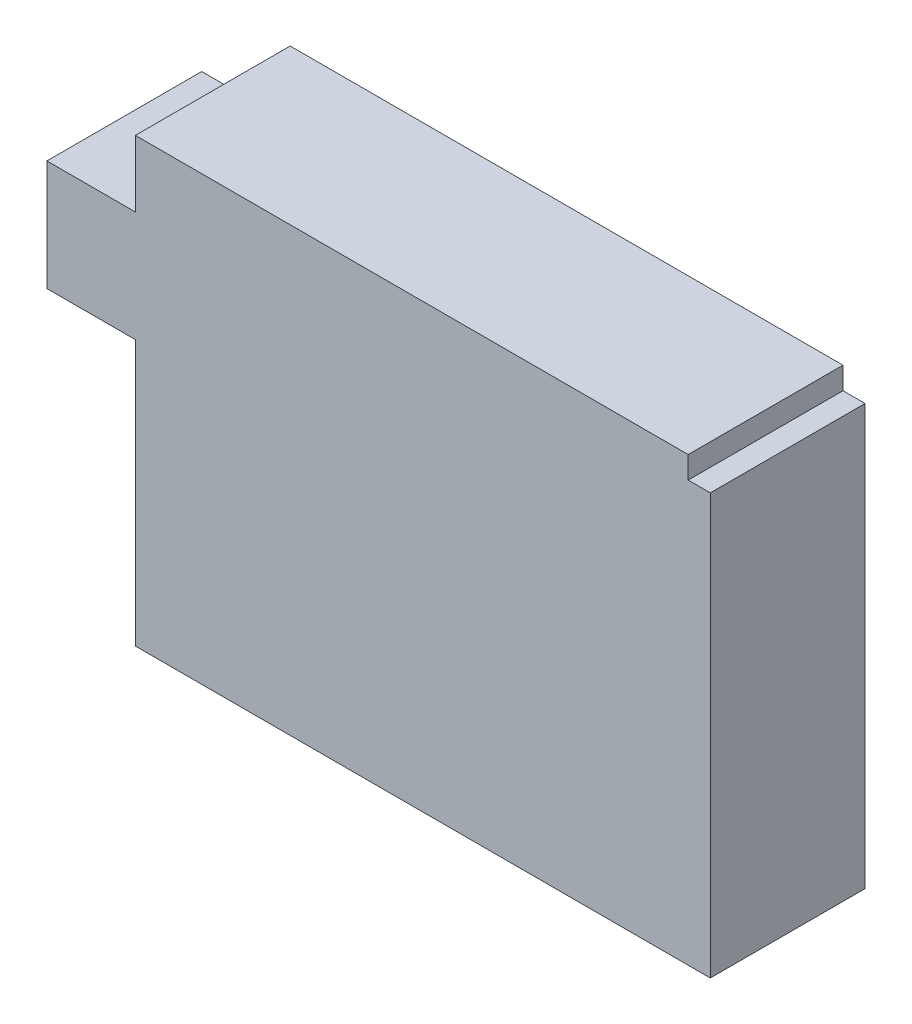
ISO-10303-21;
HEADER;
FILE_DESCRIPTION(('STEP AP214'),'2;1');
FILE_NAME('part.step','',(''),(''),'','','');
FILE_SCHEMA(('AUTOMOTIVE_DESIGN { 1 0 10303 214 1 1 1 1 }'));
ENDSEC;
DATA;
#1=APPLICATION_CONTEXT('core data for automotive mechanical design processes');
#2=APPLICATION_PROTOCOL_DEFINITION('international standard','automotive_design',2000,#1);
#3=PRODUCT_CONTEXT('',#1,'mechanical');
#4=PRODUCT('Part','Part','',(#3));
#5=PRODUCT_RELATED_PRODUCT_CATEGORY('part','',(#4));
#6=PRODUCT_DEFINITION_FORMATION('','',#4);
#7=PRODUCT_DEFINITION_CONTEXT('part definition',#1,'design');
#8=PRODUCT_DEFINITION('design','',#6,#7);
#9=PRODUCT_DEFINITION_SHAPE('','',#8);
#10=(LENGTH_UNIT() NAMED_UNIT(*) SI_UNIT(.MILLI.,.METRE.));
#11=(NAMED_UNIT(*) PLANE_ANGLE_UNIT() SI_UNIT($,.RADIAN.));
#12=(NAMED_UNIT(*) SI_UNIT($,.STERADIAN.) SOLID_ANGLE_UNIT());
#13=UNCERTAINTY_MEASURE_WITH_UNIT(LENGTH_MEASURE(1.E-05),#10,'distance_accuracy_value','');
#14=(GEOMETRIC_REPRESENTATION_CONTEXT(3) GLOBAL_UNCERTAINTY_ASSIGNED_CONTEXT((#13)) GLOBAL_UNIT_ASSIGNED_CONTEXT((#10,
#11,#12)) REPRESENTATION_CONTEXT('',''));
#15=CARTESIAN_POINT('',(0.,0.,0.));
#16=DIRECTION('',(0.,0.,1.));
#17=DIRECTION('',(1.,0.,0.));
#18=AXIS2_PLACEMENT_3D('',#15,#16,#17);
#19=CARTESIAN_POINT('',(26.,0.,7.));
#20=DIRECTION('',(0.,1.,0.));
#21=DIRECTION('',(-1.,0.,0.));
#22=AXIS2_PLACEMENT_3D('',#19,#20,#21);
#23=PLANE('',#22);
#24=DIRECTION('',(1.,0.,0.));
#25=VECTOR('',#24,1.);
#26=CARTESIAN_POINT('',(26.,0.,0.));
#27=LINE('',#26,#25);
#28=CARTESIAN_POINT('',(0.,0.,0.));
#29=VERTEX_POINT('',#28);
#30=CARTESIAN_POINT('',(26.,0.,0.));
#31=VERTEX_POINT('',#30);
#32=EDGE_CURVE('E141',#29,#31,#27,.T.);
#33=ORIENTED_EDGE('',*,*,#32,.T.);
#34=DIRECTION('',(0.,0.,-1.));
#35=VECTOR('',#34,1.);
#36=CARTESIAN_POINT('',(26.,0.,7.));
#37=LINE('',#36,#35);
#38=CARTESIAN_POINT('',(26.,0.,7.));
#39=VERTEX_POINT('',#38);
#40=EDGE_CURVE('E11',#39,#31,#37,.T.);
#41=ORIENTED_EDGE('',*,*,#40,.F.);
#42=DIRECTION('',(1.,0.,0.));
#43=VECTOR('',#42,1.);
#44=CARTESIAN_POINT('',(26.,0.,7.));
#45=LINE('',#44,#43);
#46=CARTESIAN_POINT('',(0.,0.,7.));
#47=VERTEX_POINT('',#46);
#48=EDGE_CURVE('E159',#47,#39,#45,.T.);
#49=ORIENTED_EDGE('',*,*,#48,.F.);
#50=DIRECTION('',(0.,0.,-1.));
#51=VECTOR('',#50,1.);
#52=CARTESIAN_POINT('',(0.,0.,7.));
#53=LINE('',#52,#51);
#54=EDGE_CURVE('E137',#47,#29,#53,.T.);
#55=ORIENTED_EDGE('',*,*,#54,.T.);
#56=EDGE_LOOP('',(#33,#41,#49,#55));
#57=FACE_BOUND('',#56,.T.);
#58=ADVANCED_FACE('F33',(#57),#23,.F.);
#59=CARTESIAN_POINT('',(26.,19.,7.));
#60=DIRECTION('',(-1.,0.,0.));
#61=DIRECTION('',(0.,-1.,0.));
#62=AXIS2_PLACEMENT_3D('',#59,#60,#61);
#63=PLANE('',#62);
#64=DIRECTION('',(0.,1.,0.));
#65=VECTOR('',#64,1.);
#66=CARTESIAN_POINT('',(26.,19.,0.));
#67=LINE('',#66,#65);
#68=CARTESIAN_POINT('',(26.,19.,0.));
#69=VERTEX_POINT('',#68);
#70=EDGE_CURVE('E144',#31,#69,#67,.T.);
#71=ORIENTED_EDGE('',*,*,#70,.T.);
#72=DIRECTION('',(0.,0.,-1.));
#73=VECTOR('',#72,1.);
#74=CARTESIAN_POINT('',(26.,19.,7.));
#75=LINE('',#74,#73);
#76=CARTESIAN_POINT('',(26.,19.,7.));
#77=VERTEX_POINT('',#76);
#78=EDGE_CURVE('E41',#77,#69,#75,.T.);
#79=ORIENTED_EDGE('',*,*,#78,.F.);
#80=DIRECTION('',(0.,1.,0.));
#81=VECTOR('',#80,1.);
#82=CARTESIAN_POINT('',(26.,19.,7.));
#83=LINE('',#82,#81);
#84=EDGE_CURVE('E98',#39,#77,#83,.T.);
#85=ORIENTED_EDGE('',*,*,#84,.F.);
#86=ORIENTED_EDGE('',*,*,#40,.T.);
#87=EDGE_LOOP('',(#71,#79,#85,#86));
#88=FACE_BOUND('',#87,.T.);
#89=ADVANCED_FACE('F208',(#88),#63,.F.);
#90=CARTESIAN_POINT('',(25.,19.,7.));
#91=DIRECTION('',(0.,-1.,0.));
#92=DIRECTION('',(0.,0.,-1.));
#93=AXIS2_PLACEMENT_3D('',#90,#91,#92);
#94=PLANE('',#93);
#95=DIRECTION('',(-1.,0.,0.));
#96=VECTOR('',#95,1.);
#97=CARTESIAN_POINT('',(25.,19.,0.));
#98=LINE('',#97,#96);
#99=CARTESIAN_POINT('',(25.,19.,0.));
#100=VERTEX_POINT('',#99);
#101=EDGE_CURVE('E146',#69,#100,#98,.T.);
#102=ORIENTED_EDGE('',*,*,#101,.T.);
#103=DIRECTION('',(0.,0.,-1.));
#104=VECTOR('',#103,1.);
#105=CARTESIAN_POINT('',(25.,19.,7.));
#106=LINE('',#105,#104);
#107=CARTESIAN_POINT('',(25.,19.,7.));
#108=VERTEX_POINT('',#107);
#109=EDGE_CURVE('E172',#108,#100,#106,.T.);
#110=ORIENTED_EDGE('',*,*,#109,.F.);
#111=DIRECTION('',(-1.,0.,0.));
#112=VECTOR('',#111,1.);
#113=CARTESIAN_POINT('',(25.,19.,7.));
#114=LINE('',#113,#112);
#115=EDGE_CURVE('E180',#77,#108,#114,.T.);
#116=ORIENTED_EDGE('',*,*,#115,.F.);
#117=ORIENTED_EDGE('',*,*,#78,.T.);
#118=EDGE_LOOP('',(#102,#110,#116,#117));
#119=FACE_BOUND('',#118,.T.);
#120=ADVANCED_FACE('F178',(#119),#94,.F.);
#121=CARTESIAN_POINT('',(25.,20.,7.));
#122=DIRECTION('',(-1.,0.,0.));
#123=DIRECTION('',(0.,0.,1.));
#124=AXIS2_PLACEMENT_3D('',#121,#122,#123);
#125=PLANE('',#124);
#126=DIRECTION('',(0.,1.,0.));
#127=VECTOR('',#126,1.);
#128=CARTESIAN_POINT('',(25.,20.,0.));
#129=LINE('',#128,#127);
#130=CARTESIAN_POINT('',(25.,20.,0.));
#131=VERTEX_POINT('',#130);
#132=EDGE_CURVE('E148',#100,#131,#129,.T.);
#133=ORIENTED_EDGE('',*,*,#132,.T.);
#134=DIRECTION('',(0.,0.,-1.));
#135=VECTOR('',#134,1.);
#136=CARTESIAN_POINT('',(25.,20.,7.));
#137=LINE('',#136,#135);
#138=CARTESIAN_POINT('',(25.,20.,7.));
#139=VERTEX_POINT('',#138);
#140=EDGE_CURVE('E169',#139,#131,#137,.T.);
#141=ORIENTED_EDGE('',*,*,#140,.F.);
#142=DIRECTION('',(0.,1.,0.));
#143=VECTOR('',#142,1.);
#144=CARTESIAN_POINT('',(25.,20.,7.));
#145=LINE('',#144,#143);
#146=EDGE_CURVE('E198',#108,#139,#145,.T.);
#147=ORIENTED_EDGE('',*,*,#146,.F.);
#148=ORIENTED_EDGE('',*,*,#109,.T.);
#149=EDGE_LOOP('',(#133,#141,#147,#148));
#150=FACE_BOUND('',#149,.T.);
#151=ADVANCED_FACE('F189',(#150),#125,.F.);
#152=CARTESIAN_POINT('',(0.,20.,7.));
#153=DIRECTION('',(0.,-1.,0.));
#154=DIRECTION('',(1.,0.,0.));
#155=AXIS2_PLACEMENT_3D('',#152,#153,#154);
#156=PLANE('',#155);
#157=DIRECTION('',(-1.,0.,0.));
#158=VECTOR('',#157,1.);
#159=CARTESIAN_POINT('',(0.,20.,0.));
#160=LINE('',#159,#158);
#161=CARTESIAN_POINT('',(0.,20.,0.));
#162=VERTEX_POINT('',#161);
#163=EDGE_CURVE('E150',#131,#162,#160,.T.);
#164=ORIENTED_EDGE('',*,*,#163,.T.);
#165=DIRECTION('',(0.,0.,-1.));
#166=VECTOR('',#165,1.);
#167=CARTESIAN_POINT('',(0.,20.,7.));
#168=LINE('',#167,#166);
#169=CARTESIAN_POINT('',(0.,20.,7.));
#170=VERTEX_POINT('',#169);
#171=EDGE_CURVE('E166',#170,#162,#168,.T.);
#172=ORIENTED_EDGE('',*,*,#171,.F.);
#173=DIRECTION('',(-1.,0.,0.));
#174=VECTOR('',#173,1.);
#175=CARTESIAN_POINT('',(0.,20.,7.));
#176=LINE('',#175,#174);
#177=EDGE_CURVE('E195',#139,#170,#176,.T.);
#178=ORIENTED_EDGE('',*,*,#177,.F.);
#179=ORIENTED_EDGE('',*,*,#140,.T.);
#180=EDGE_LOOP('',(#164,#172,#178,#179));
#181=FACE_BOUND('',#180,.T.);
#182=ADVANCED_FACE('F193',(#181),#156,.F.);
#183=CARTESIAN_POINT('',(0.,17.,7.));
#184=DIRECTION('',(1.,0.,0.));
#185=DIRECTION('',(0.,0.,-1.));
#186=AXIS2_PLACEMENT_3D('',#183,#184,#185);
#187=PLANE('',#186);
#188=DIRECTION('',(0.,-1.,0.));
#189=VECTOR('',#188,1.);
#190=CARTESIAN_POINT('',(0.,17.,0.));
#191=LINE('',#190,#189);
#192=CARTESIAN_POINT('',(0.,17.,0.));
#193=VERTEX_POINT('',#192);
#194=EDGE_CURVE('E152',#162,#193,#191,.T.);
#195=ORIENTED_EDGE('',*,*,#194,.T.);
#196=DIRECTION('',(0.,0.,-1.));
#197=VECTOR('',#196,1.);
#198=CARTESIAN_POINT('',(0.,17.,7.));
#199=LINE('',#198,#197);
#200=CARTESIAN_POINT('',(0.,17.,7.));
#201=VERTEX_POINT('',#200);
#202=EDGE_CURVE('E163',#201,#193,#199,.T.);
#203=ORIENTED_EDGE('',*,*,#202,.F.);
#204=DIRECTION('',(0.,-1.,0.));
#205=VECTOR('',#204,1.);
#206=CARTESIAN_POINT('',(0.,17.,7.));
#207=LINE('',#206,#205);
#208=EDGE_CURVE('E197',#170,#201,#207,.T.);
#209=ORIENTED_EDGE('',*,*,#208,.F.);
#210=ORIENTED_EDGE('',*,*,#171,.T.);
#211=EDGE_LOOP('',(#195,#203,#209,#210));
#212=FACE_BOUND('',#211,.T.);
#213=ADVANCED_FACE('F220',(#212),#187,.F.);
#214=CARTESIAN_POINT('',(-4.,17.,7.));
#215=DIRECTION('',(0.,-1.,0.));
#216=DIRECTION('',(0.,0.,-1.));
#217=AXIS2_PLACEMENT_3D('',#214,#215,#216);
#218=PLANE('',#217);
#219=DIRECTION('',(-1.,0.,0.));
#220=VECTOR('',#219,1.);
#221=CARTESIAN_POINT('',(-4.,17.,0.));
#222=LINE('',#221,#220);
#223=CARTESIAN_POINT('',(-4.,17.,0.));
#224=VERTEX_POINT('',#223);
#225=EDGE_CURVE('E154',#193,#224,#222,.T.);
#226=ORIENTED_EDGE('',*,*,#225,.T.);
#227=DIRECTION('',(0.,0.,-1.));
#228=VECTOR('',#227,1.);
#229=CARTESIAN_POINT('',(-4.,17.,7.));
#230=LINE('',#229,#228);
#231=CARTESIAN_POINT('',(-4.,17.,7.));
#232=VERTEX_POINT('',#231);
#233=EDGE_CURVE('E132',#232,#224,#230,.T.);
#234=ORIENTED_EDGE('',*,*,#233,.F.);
#235=DIRECTION('',(-1.,0.,0.));
#236=VECTOR('',#235,1.);
#237=CARTESIAN_POINT('',(-4.,17.,7.));
#238=LINE('',#237,#236);
#239=EDGE_CURVE('E123',#201,#232,#238,.T.);
#240=ORIENTED_EDGE('',*,*,#239,.F.);
#241=ORIENTED_EDGE('',*,*,#202,.T.);
#242=EDGE_LOOP('',(#226,#234,#240,#241));
#243=FACE_BOUND('',#242,.T.);
#244=ADVANCED_FACE('F223',(#243),#218,.F.);
#245=CARTESIAN_POINT('',(-4.,12.,7.));
#246=DIRECTION('',(1.,0.,0.));
#247=DIRECTION('',(0.,1.,0.));
#248=AXIS2_PLACEMENT_3D('',#245,#246,#247);
#249=PLANE('',#248);
#250=DIRECTION('',(0.,-1.,0.));
#251=VECTOR('',#250,1.);
#252=CARTESIAN_POINT('',(-4.,12.,0.));
#253=LINE('',#252,#251);
#254=CARTESIAN_POINT('',(-4.,12.,0.));
#255=VERTEX_POINT('',#254);
#256=EDGE_CURVE('E131',#224,#255,#253,.T.);
#257=ORIENTED_EDGE('',*,*,#256,.T.);
#258=DIRECTION('',(0.,0.,-1.));
#259=VECTOR('',#258,1.);
#260=CARTESIAN_POINT('',(-4.,12.,7.));
#261=LINE('',#260,#259);
#262=CARTESIAN_POINT('',(-4.,12.,7.));
#263=VERTEX_POINT('',#262);
#264=EDGE_CURVE('E128',#263,#255,#261,.T.);
#265=ORIENTED_EDGE('',*,*,#264,.F.);
#266=DIRECTION('',(0.,-1.,0.));
#267=VECTOR('',#266,1.);
#268=CARTESIAN_POINT('',(-4.,12.,7.));
#269=LINE('',#268,#267);
#270=EDGE_CURVE('E117',#232,#263,#269,.T.);
#271=ORIENTED_EDGE('',*,*,#270,.F.);
#272=ORIENTED_EDGE('',*,*,#233,.T.);
#273=EDGE_LOOP('',(#257,#265,#271,#272));
#274=FACE_BOUND('',#273,.T.);
#275=ADVANCED_FACE('F129',(#274),#249,.F.);
#276=CARTESIAN_POINT('',(0.,12.,7.));
#277=DIRECTION('',(0.,1.,0.));
#278=DIRECTION('',(0.,0.,1.));
#279=AXIS2_PLACEMENT_3D('',#276,#277,#278);
#280=PLANE('',#279);
#281=DIRECTION('',(1.,0.,0.));
#282=VECTOR('',#281,1.);
#283=CARTESIAN_POINT('',(0.,12.,0.));
#284=LINE('',#283,#282);
#285=CARTESIAN_POINT('',(0.,12.,0.));
#286=VERTEX_POINT('',#285);
#287=EDGE_CURVE('E84',#255,#286,#284,.T.);
#288=ORIENTED_EDGE('',*,*,#287,.T.);
#289=DIRECTION('',(0.,0.,-1.));
#290=VECTOR('',#289,1.);
#291=CARTESIAN_POINT('',(0.,12.,7.));
#292=LINE('',#291,#290);
#293=CARTESIAN_POINT('',(0.,12.,7.));
#294=VERTEX_POINT('',#293);
#295=EDGE_CURVE('E133',#294,#286,#292,.T.);
#296=ORIENTED_EDGE('',*,*,#295,.F.);
#297=DIRECTION('',(1.,0.,0.));
#298=VECTOR('',#297,1.);
#299=CARTESIAN_POINT('',(0.,12.,7.));
#300=LINE('',#299,#298);
#301=EDGE_CURVE('E121',#263,#294,#300,.T.);
#302=ORIENTED_EDGE('',*,*,#301,.F.);
#303=ORIENTED_EDGE('',*,*,#264,.T.);
#304=EDGE_LOOP('',(#288,#296,#302,#303));
#305=FACE_BOUND('',#304,.T.);
#306=ADVANCED_FACE('F135',(#305),#280,.F.);
#307=CARTESIAN_POINT('',(0.,0.,7.));
#308=DIRECTION('',(1.,0.,0.));
#309=DIRECTION('',(0.,0.,-1.));
#310=AXIS2_PLACEMENT_3D('',#307,#308,#309);
#311=PLANE('',#310);
#312=DIRECTION('',(0.,-1.,0.));
#313=VECTOR('',#312,1.);
#314=CARTESIAN_POINT('',(0.,0.,0.));
#315=LINE('',#314,#313);
#316=EDGE_CURVE('E90',#286,#29,#315,.T.);
#317=ORIENTED_EDGE('',*,*,#316,.T.);
#318=ORIENTED_EDGE('',*,*,#54,.F.);
#319=DIRECTION('',(0.,-1.,0.));
#320=VECTOR('',#319,1.);
#321=CARTESIAN_POINT('',(0.,0.,7.));
#322=LINE('',#321,#320);
#323=EDGE_CURVE('E49',#294,#47,#322,.T.);
#324=ORIENTED_EDGE('',*,*,#323,.F.);
#325=ORIENTED_EDGE('',*,*,#295,.T.);
#326=EDGE_LOOP('',(#317,#318,#324,#325));
#327=FACE_BOUND('',#326,.T.);
#328=ADVANCED_FACE('F232',(#327),#311,.F.);
#329=CARTESIAN_POINT('',(0.,0.,7.));
#330=DIRECTION('',(0.,0.,-1.));
#331=DIRECTION('',(-1.,0.,0.));
#332=AXIS2_PLACEMENT_3D('',#329,#330,#331);
#333=PLANE('',#332);
#334=ORIENTED_EDGE('',*,*,#48,.T.);
#335=ORIENTED_EDGE('',*,*,#84,.T.);
#336=ORIENTED_EDGE('',*,*,#115,.T.);
#337=ORIENTED_EDGE('',*,*,#146,.T.);
#338=ORIENTED_EDGE('',*,*,#177,.T.);
#339=ORIENTED_EDGE('',*,*,#208,.T.);
#340=ORIENTED_EDGE('',*,*,#239,.T.);
#341=ORIENTED_EDGE('',*,*,#270,.T.);
#342=ORIENTED_EDGE('',*,*,#301,.T.);
#343=ORIENTED_EDGE('',*,*,#323,.T.);
#344=EDGE_LOOP('',(#334,#335,#336,#337,#338,#339,#340,#341,#342,#343));
#345=FACE_BOUND('',#344,.T.);
#346=ADVANCED_FACE('F119',(#345),#333,.F.);
#347=CARTESIAN_POINT('',(0.,0.,0.));
#348=DIRECTION('',(0.,0.,-1.));
#349=DIRECTION('',(-1.,0.,0.));
#350=AXIS2_PLACEMENT_3D('',#347,#348,#349);
#351=PLANE('',#350);
#352=ORIENTED_EDGE('',*,*,#32,.F.);
#353=ORIENTED_EDGE('',*,*,#316,.F.);
#354=ORIENTED_EDGE('',*,*,#287,.F.);
#355=ORIENTED_EDGE('',*,*,#256,.F.);
#356=ORIENTED_EDGE('',*,*,#225,.F.);
#357=ORIENTED_EDGE('',*,*,#194,.F.);
#358=ORIENTED_EDGE('',*,*,#163,.F.);
#359=ORIENTED_EDGE('',*,*,#132,.F.);
#360=ORIENTED_EDGE('',*,*,#101,.F.);
#361=ORIENTED_EDGE('',*,*,#70,.F.);
#362=EDGE_LOOP('',(#352,#353,#354,#355,#356,#357,#358,#359,#360,#361));
#363=FACE_BOUND('',#362,.T.);
#364=ADVANCED_FACE('F184',(#363),#351,.T.);
#365=CLOSED_SHELL('',(#58,#89,#120,#151,#182,#213,#244,#275,#306,#328,#346,#364));
#366=MANIFOLD_SOLID_BREP('B2',#365);
#367=ADVANCED_BREP_SHAPE_REPRESENTATION('',(#18,#366),#14);
#368=SHAPE_DEFINITION_REPRESENTATION(#9,#367);
ENDSEC;
END-ISO-10303-21;
